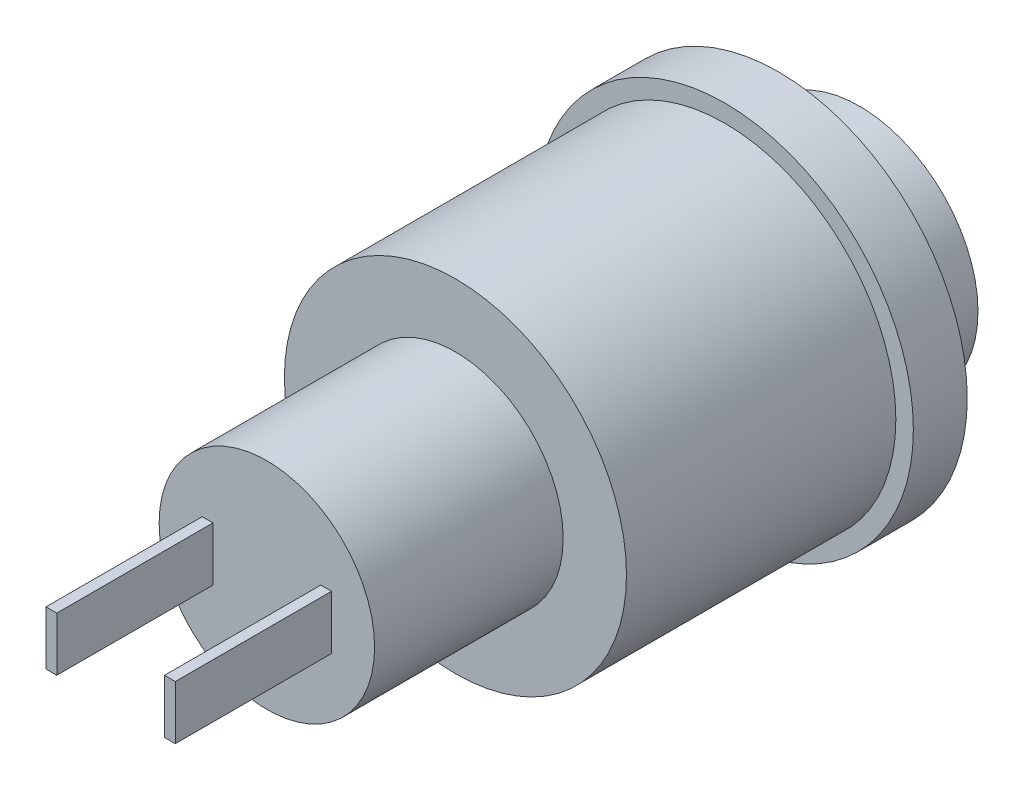
ISO-10303-21;
HEADER;
FILE_DESCRIPTION(('STEP AP214'),'2;1');
FILE_NAME('part.step','',(''),(''),'','','');
FILE_SCHEMA(('AUTOMOTIVE_DESIGN { 1 0 10303 214 1 1 1 1 }'));
ENDSEC;
DATA;
#1=APPLICATION_CONTEXT('core data for automotive mechanical design processes');
#2=APPLICATION_PROTOCOL_DEFINITION('international standard','automotive_design',2000,#1);
#3=PRODUCT_CONTEXT('',#1,'mechanical');
#4=PRODUCT('Part','Part','',(#3));
#5=PRODUCT_RELATED_PRODUCT_CATEGORY('part','',(#4));
#6=PRODUCT_DEFINITION_FORMATION('','',#4);
#7=PRODUCT_DEFINITION_CONTEXT('part definition',#1,'design');
#8=PRODUCT_DEFINITION('design','',#6,#7);
#9=PRODUCT_DEFINITION_SHAPE('','',#8);
#10=(LENGTH_UNIT() NAMED_UNIT(*) SI_UNIT(.MILLI.,.METRE.));
#11=(NAMED_UNIT(*) PLANE_ANGLE_UNIT() SI_UNIT($,.RADIAN.));
#12=(NAMED_UNIT(*) SI_UNIT($,.STERADIAN.) SOLID_ANGLE_UNIT());
#13=UNCERTAINTY_MEASURE_WITH_UNIT(LENGTH_MEASURE(1.E-05),#10,'distance_accuracy_value','');
#14=(GEOMETRIC_REPRESENTATION_CONTEXT(3) GLOBAL_UNCERTAINTY_ASSIGNED_CONTEXT((#13)) GLOBAL_UNIT_ASSIGNED_CONTEXT((#10,
#11,#12)) REPRESENTATION_CONTEXT('',''));
#15=CARTESIAN_POINT('',(0.,0.,0.));
#16=DIRECTION('',(0.,0.,1.));
#17=DIRECTION('',(1.,0.,0.));
#18=AXIS2_PLACEMENT_3D('',#15,#16,#17);
#19=CARTESIAN_POINT('',(0.,0.,22.));
#20=DIRECTION('',(0.,0.,1.));
#21=DIRECTION('',(1.,0.,0.));
#22=AXIS2_PLACEMENT_3D('',#19,#20,#21);
#23=PLANE('',#22);
#24=CARTESIAN_POINT('',(0.,0.,22.));
#25=DIRECTION('',(0.,0.,1.));
#26=DIRECTION('',(1.,0.,0.));
#27=AXIS2_PLACEMENT_3D('',#24,#25,#26);
#28=CIRCLE('',#27,4.);
#29=CARTESIAN_POINT('',(4.,0.,22.));
#30=VERTEX_POINT('',#29);
#31=EDGE_CURVE('E180',#30,#30,#28,.T.);
#32=ORIENTED_EDGE('',*,*,#31,.T.);
#33=EDGE_LOOP('',(#32));
#34=FACE_BOUND('',#33,.T.);
#35=DIRECTION('',(1.,0.,0.));
#36=VECTOR('',#35,1.);
#37=CARTESIAN_POINT('',(-2.4,-1.,22.));
#38=LINE('',#37,#36);
#39=CARTESIAN_POINT('',(-2.4,-1.,22.));
#40=VERTEX_POINT('',#39);
#41=CARTESIAN_POINT('',(-2.,-1.,22.));
#42=VERTEX_POINT('',#41);
#43=EDGE_CURVE('E141',#40,#42,#38,.T.);
#44=ORIENTED_EDGE('',*,*,#43,.F.);
#45=DIRECTION('',(0.,-1.,0.));
#46=VECTOR('',#45,1.);
#47=CARTESIAN_POINT('',(-2.4,1.,22.));
#48=LINE('',#47,#46);
#49=CARTESIAN_POINT('',(-2.4,1.,22.));
#50=VERTEX_POINT('',#49);
#51=EDGE_CURVE('E136',#50,#40,#48,.T.);
#52=ORIENTED_EDGE('',*,*,#51,.F.);
#53=DIRECTION('',(-1.,0.,0.));
#54=VECTOR('',#53,1.);
#55=CARTESIAN_POINT('',(-2.4,1.,22.));
#56=LINE('',#55,#54);
#57=CARTESIAN_POINT('',(-2.,1.,22.));
#58=VERTEX_POINT('',#57);
#59=EDGE_CURVE('E151',#58,#50,#56,.T.);
#60=ORIENTED_EDGE('',*,*,#59,.F.);
#61=DIRECTION('',(0.,1.,0.));
#62=VECTOR('',#61,1.);
#63=CARTESIAN_POINT('',(-2.,1.,22.));
#64=LINE('',#63,#62);
#65=EDGE_CURVE('E163',#42,#58,#64,.T.);
#66=ORIENTED_EDGE('',*,*,#65,.F.);
#67=EDGE_LOOP('',(#44,#52,#60,#66));
#68=FACE_BOUND('',#67,.T.);
#69=DIRECTION('',(1.,0.,0.));
#70=VECTOR('',#69,1.);
#71=CARTESIAN_POINT('',(2.,-0.999999999999999,22.));
#72=LINE('',#71,#70);
#73=CARTESIAN_POINT('',(2.,-0.999999999999999,22.));
#74=VERTEX_POINT('',#73);
#75=CARTESIAN_POINT('',(2.4,-0.999999999999999,22.));
#76=VERTEX_POINT('',#75);
#77=EDGE_CURVE('E397',#74,#76,#72,.T.);
#78=ORIENTED_EDGE('',*,*,#77,.F.);
#79=DIRECTION('',(0.,-1.,0.));
#80=VECTOR('',#79,1.);
#81=CARTESIAN_POINT('',(2.,1.,22.));
#82=LINE('',#81,#80);
#83=CARTESIAN_POINT('',(2.,1.,22.));
#84=VERTEX_POINT('',#83);
#85=EDGE_CURVE('E133',#84,#74,#82,.T.);
#86=ORIENTED_EDGE('',*,*,#85,.F.);
#87=DIRECTION('',(-1.,0.,0.));
#88=VECTOR('',#87,1.);
#89=CARTESIAN_POINT('',(2.,1.,22.));
#90=LINE('',#89,#88);
#91=CARTESIAN_POINT('',(2.4,1.,22.));
#92=VERTEX_POINT('',#91);
#93=EDGE_CURVE('E129',#92,#84,#90,.T.);
#94=ORIENTED_EDGE('',*,*,#93,.F.);
#95=DIRECTION('',(0.,1.,0.));
#96=VECTOR('',#95,1.);
#97=CARTESIAN_POINT('',(2.4,1.,22.));
#98=LINE('',#97,#96);
#99=EDGE_CURVE('E393',#76,#92,#98,.T.);
#100=ORIENTED_EDGE('',*,*,#99,.F.);
#101=EDGE_LOOP('',(#78,#86,#94,#100));
#102=FACE_BOUND('',#101,.T.);
#103=ADVANCED_FACE('F39',(#34,#68,#102),#23,.T.);
#104=CARTESIAN_POINT('',(0.,0.,3.));
#105=DIRECTION('',(0.,0.,-1.));
#106=DIRECTION('',(-1.,0.,0.));
#107=AXIS2_PLACEMENT_3D('',#104,#105,#106);
#108=CYLINDRICAL_SURFACE('',#107,4.4);
#109=CARTESIAN_POINT('',(0.,0.,3.));
#110=DIRECTION('',(0.,0.,1.));
#111=DIRECTION('',(1.,0.,0.));
#112=AXIS2_PLACEMENT_3D('',#109,#110,#111);
#113=CIRCLE('',#112,4.4);
#114=CARTESIAN_POINT('',(4.4,0.,3.));
#115=VERTEX_POINT('',#114);
#116=EDGE_CURVE('E192',#115,#115,#113,.T.);
#117=ORIENTED_EDGE('',*,*,#116,.F.);
#118=EDGE_LOOP('',(#117));
#119=FACE_BOUND('',#118,.T.);
#120=CARTESIAN_POINT('',(0.,0.,0.));
#121=DIRECTION('',(0.,0.,1.));
#122=DIRECTION('',(1.,0.,0.));
#123=AXIS2_PLACEMENT_3D('',#120,#121,#122);
#124=CIRCLE('',#123,4.4);
#125=CARTESIAN_POINT('',(4.4,0.,0.));
#126=VERTEX_POINT('',#125);
#127=EDGE_CURVE('E43',#126,#126,#124,.T.);
#128=ORIENTED_EDGE('',*,*,#127,.T.);
#129=EDGE_LOOP('',(#128));
#130=FACE_BOUND('',#129,.T.);
#131=ADVANCED_FACE('F41',(#119,#130),#108,.T.);
#132=CARTESIAN_POINT('',(0.,0.,0.));
#133=DIRECTION('',(0.,0.,1.));
#134=DIRECTION('',(1.,0.,0.));
#135=AXIS2_PLACEMENT_3D('',#132,#133,#134);
#136=PLANE('',#135);
#137=ORIENTED_EDGE('',*,*,#127,.F.);
#138=EDGE_LOOP('',(#137));
#139=FACE_BOUND('',#138,.T.);
#140=ADVANCED_FACE('F208',(#139),#136,.F.);
#141=CARTESIAN_POINT('',(0.,0.,5.));
#142=DIRECTION('',(0.,0.,-1.));
#143=DIRECTION('',(-1.,0.,0.));
#144=AXIS2_PLACEMENT_3D('',#141,#142,#143);
#145=CYLINDRICAL_SURFACE('',#144,7.);
#146=CARTESIAN_POINT('',(0.,0.,5.));
#147=DIRECTION('',(0.,0.,1.));
#148=DIRECTION('',(1.,0.,0.));
#149=AXIS2_PLACEMENT_3D('',#146,#147,#148);
#150=CIRCLE('',#149,7.);
#151=CARTESIAN_POINT('',(7.,0.,5.));
#152=VERTEX_POINT('',#151);
#153=EDGE_CURVE('E193',#152,#152,#150,.T.);
#154=ORIENTED_EDGE('',*,*,#153,.F.);
#155=EDGE_LOOP('',(#154));
#156=FACE_BOUND('',#155,.T.);
#157=CARTESIAN_POINT('',(0.,0.,3.));
#158=DIRECTION('',(0.,0.,1.));
#159=DIRECTION('',(1.,0.,0.));
#160=AXIS2_PLACEMENT_3D('',#157,#158,#159);
#161=CIRCLE('',#160,7.);
#162=CARTESIAN_POINT('',(7.,0.,3.));
#163=VERTEX_POINT('',#162);
#164=EDGE_CURVE('E188',#163,#163,#161,.T.);
#165=ORIENTED_EDGE('',*,*,#164,.T.);
#166=EDGE_LOOP('',(#165));
#167=FACE_BOUND('',#166,.T.);
#168=ADVANCED_FACE('F210',(#156,#167),#145,.T.);
#169=CARTESIAN_POINT('',(0.,0.,5.));
#170=DIRECTION('',(0.,0.,1.));
#171=DIRECTION('',(1.,0.,0.));
#172=AXIS2_PLACEMENT_3D('',#169,#170,#171);
#173=PLANE('',#172);
#174=CARTESIAN_POINT('',(0.,0.,5.));
#175=DIRECTION('',(0.,0.,1.));
#176=DIRECTION('',(1.,0.,0.));
#177=AXIS2_PLACEMENT_3D('',#174,#175,#176);
#178=CIRCLE('',#177,6.35);
#179=CARTESIAN_POINT('',(6.35,0.,5.));
#180=VERTEX_POINT('',#179);
#181=EDGE_CURVE('E49',#180,#180,#178,.T.);
#182=ORIENTED_EDGE('',*,*,#181,.F.);
#183=EDGE_LOOP('',(#182));
#184=FACE_BOUND('',#183,.T.);
#185=ORIENTED_EDGE('',*,*,#153,.T.);
#186=EDGE_LOOP('',(#185));
#187=FACE_BOUND('',#186,.T.);
#188=ADVANCED_FACE('F215',(#184,#187),#173,.T.);
#189=CARTESIAN_POINT('',(0.,0.,3.));
#190=DIRECTION('',(0.,0.,1.));
#191=DIRECTION('',(1.,0.,0.));
#192=AXIS2_PLACEMENT_3D('',#189,#190,#191);
#193=PLANE('',#192);
#194=ORIENTED_EDGE('',*,*,#116,.T.);
#195=EDGE_LOOP('',(#194));
#196=FACE_BOUND('',#195,.T.);
#197=ORIENTED_EDGE('',*,*,#164,.F.);
#198=EDGE_LOOP('',(#197));
#199=FACE_BOUND('',#198,.T.);
#200=ADVANCED_FACE('F240',(#196,#199),#193,.F.);
#201=CARTESIAN_POINT('',(0.,0.,15.));
#202=DIRECTION('',(0.,0.,-1.));
#203=DIRECTION('',(-1.,0.,0.));
#204=AXIS2_PLACEMENT_3D('',#201,#202,#203);
#205=CYLINDRICAL_SURFACE('',#204,6.35);
#206=CARTESIAN_POINT('',(0.,0.,15.));
#207=DIRECTION('',(0.,0.,1.));
#208=DIRECTION('',(1.,0.,0.));
#209=AXIS2_PLACEMENT_3D('',#206,#207,#208);
#210=CIRCLE('',#209,6.35);
#211=CARTESIAN_POINT('',(6.35,0.,15.));
#212=VERTEX_POINT('',#211);
#213=EDGE_CURVE('E183',#212,#212,#210,.T.);
#214=ORIENTED_EDGE('',*,*,#213,.F.);
#215=EDGE_LOOP('',(#214));
#216=FACE_BOUND('',#215,.T.);
#217=ORIENTED_EDGE('',*,*,#181,.T.);
#218=EDGE_LOOP('',(#217));
#219=FACE_BOUND('',#218,.T.);
#220=ADVANCED_FACE('F236',(#216,#219),#205,.T.);
#221=CARTESIAN_POINT('',(0.,0.,15.));
#222=DIRECTION('',(0.,0.,1.));
#223=DIRECTION('',(1.,0.,0.));
#224=AXIS2_PLACEMENT_3D('',#221,#222,#223);
#225=PLANE('',#224);
#226=CARTESIAN_POINT('',(0.,0.,15.));
#227=DIRECTION('',(0.,0.,1.));
#228=DIRECTION('',(1.,0.,0.));
#229=AXIS2_PLACEMENT_3D('',#226,#227,#228);
#230=CIRCLE('',#229,4.);
#231=CARTESIAN_POINT('',(4.,0.,15.));
#232=VERTEX_POINT('',#231);
#233=EDGE_CURVE('E11',#232,#232,#230,.T.);
#234=ORIENTED_EDGE('',*,*,#233,.F.);
#235=EDGE_LOOP('',(#234));
#236=FACE_BOUND('',#235,.T.);
#237=ORIENTED_EDGE('',*,*,#213,.T.);
#238=EDGE_LOOP('',(#237));
#239=FACE_BOUND('',#238,.T.);
#240=ADVANCED_FACE('F232',(#236,#239),#225,.T.);
#241=CARTESIAN_POINT('',(0.,0.,22.));
#242=DIRECTION('',(0.,0.,-1.));
#243=DIRECTION('',(-1.,0.,0.));
#244=AXIS2_PLACEMENT_3D('',#241,#242,#243);
#245=CYLINDRICAL_SURFACE('',#244,4.);
#246=ORIENTED_EDGE('',*,*,#31,.F.);
#247=EDGE_LOOP('',(#246));
#248=FACE_BOUND('',#247,.T.);
#249=ORIENTED_EDGE('',*,*,#233,.T.);
#250=EDGE_LOOP('',(#249));
#251=FACE_BOUND('',#250,.T.);
#252=ADVANCED_FACE('F229',(#248,#251),#245,.T.);
#253=CARTESIAN_POINT('',(-2.4,1.,27.8));
#254=DIRECTION('',(1.,0.,0.));
#255=DIRECTION('',(0.,0.,-1.));
#256=AXIS2_PLACEMENT_3D('',#253,#254,#255);
#257=PLANE('',#256);
#258=ORIENTED_EDGE('',*,*,#51,.T.);
#259=DIRECTION('',(0.,0.,-1.));
#260=VECTOR('',#259,1.);
#261=CARTESIAN_POINT('',(-2.4,-1.,27.8));
#262=LINE('',#261,#260);
#263=CARTESIAN_POINT('',(-2.4,-1.,27.8));
#264=VERTEX_POINT('',#263);
#265=EDGE_CURVE('E177',#264,#40,#262,.T.);
#266=ORIENTED_EDGE('',*,*,#265,.F.);
#267=DIRECTION('',(0.,-1.,0.));
#268=VECTOR('',#267,1.);
#269=CARTESIAN_POINT('',(-2.4,1.,27.8));
#270=LINE('',#269,#268);
#271=CARTESIAN_POINT('',(-2.4,1.,27.8));
#272=VERTEX_POINT('',#271);
#273=EDGE_CURVE('E146',#272,#264,#270,.T.);
#274=ORIENTED_EDGE('',*,*,#273,.F.);
#275=DIRECTION('',(0.,0.,-1.));
#276=VECTOR('',#275,1.);
#277=CARTESIAN_POINT('',(-2.4,1.,27.8));
#278=LINE('',#277,#276);
#279=EDGE_CURVE('E159',#272,#50,#278,.T.);
#280=ORIENTED_EDGE('',*,*,#279,.T.);
#281=EDGE_LOOP('',(#258,#266,#274,#280));
#282=FACE_BOUND('',#281,.T.);
#283=ADVANCED_FACE('F227',(#282),#257,.F.);
#284=CARTESIAN_POINT('',(-2.4,-1.,27.8));
#285=DIRECTION('',(0.,1.,0.));
#286=DIRECTION('',(0.,0.,1.));
#287=AXIS2_PLACEMENT_3D('',#284,#285,#286);
#288=PLANE('',#287);
#289=ORIENTED_EDGE('',*,*,#43,.T.);
#290=DIRECTION('',(0.,0.,-1.));
#291=VECTOR('',#290,1.);
#292=CARTESIAN_POINT('',(-2.,-1.,27.8));
#293=LINE('',#292,#291);
#294=CARTESIAN_POINT('',(-2.,-1.,27.8));
#295=VERTEX_POINT('',#294);
#296=EDGE_CURVE('E173',#295,#42,#293,.T.);
#297=ORIENTED_EDGE('',*,*,#296,.F.);
#298=DIRECTION('',(1.,0.,0.));
#299=VECTOR('',#298,1.);
#300=CARTESIAN_POINT('',(-2.4,-1.,27.8));
#301=LINE('',#300,#299);
#302=EDGE_CURVE('E150',#264,#295,#301,.T.);
#303=ORIENTED_EDGE('',*,*,#302,.F.);
#304=ORIENTED_EDGE('',*,*,#265,.T.);
#305=EDGE_LOOP('',(#289,#297,#303,#304));
#306=FACE_BOUND('',#305,.T.);
#307=ADVANCED_FACE('F272',(#306),#288,.F.);
#308=CARTESIAN_POINT('',(-2.,1.,27.8));
#309=DIRECTION('',(-1.,0.,0.));
#310=DIRECTION('',(0.,0.,1.));
#311=AXIS2_PLACEMENT_3D('',#308,#309,#310);
#312=PLANE('',#311);
#313=ORIENTED_EDGE('',*,*,#65,.T.);
#314=DIRECTION('',(0.,0.,-1.));
#315=VECTOR('',#314,1.);
#316=CARTESIAN_POINT('',(-2.,1.,27.8));
#317=LINE('',#316,#315);
#318=CARTESIAN_POINT('',(-2.,1.,27.8));
#319=VERTEX_POINT('',#318);
#320=EDGE_CURVE('E65',#319,#58,#317,.T.);
#321=ORIENTED_EDGE('',*,*,#320,.F.);
#322=DIRECTION('',(0.,1.,0.));
#323=VECTOR('',#322,1.);
#324=CARTESIAN_POINT('',(-2.,1.,27.8));
#325=LINE('',#324,#323);
#326=EDGE_CURVE('E154',#295,#319,#325,.T.);
#327=ORIENTED_EDGE('',*,*,#326,.F.);
#328=ORIENTED_EDGE('',*,*,#296,.T.);
#329=EDGE_LOOP('',(#313,#321,#327,#328));
#330=FACE_BOUND('',#329,.T.);
#331=ADVANCED_FACE('F279',(#330),#312,.F.);
#332=CARTESIAN_POINT('',(-2.4,1.,27.8));
#333=DIRECTION('',(0.,-1.,0.));
#334=DIRECTION('',(0.,0.,-1.));
#335=AXIS2_PLACEMENT_3D('',#332,#333,#334);
#336=PLANE('',#335);
#337=ORIENTED_EDGE('',*,*,#59,.T.);
#338=ORIENTED_EDGE('',*,*,#279,.F.);
#339=DIRECTION('',(-1.,0.,0.));
#340=VECTOR('',#339,1.);
#341=CARTESIAN_POINT('',(-2.4,1.,27.8));
#342=LINE('',#341,#340);
#343=EDGE_CURVE('E157',#319,#272,#342,.T.);
#344=ORIENTED_EDGE('',*,*,#343,.F.);
#345=ORIENTED_EDGE('',*,*,#320,.T.);
#346=EDGE_LOOP('',(#337,#338,#344,#345));
#347=FACE_BOUND('',#346,.T.);
#348=ADVANCED_FACE('F286',(#347),#336,.F.);
#349=CARTESIAN_POINT('',(0.,0.,27.8));
#350=DIRECTION('',(0.,0.,1.));
#351=DIRECTION('',(1.,0.,0.));
#352=AXIS2_PLACEMENT_3D('',#349,#350,#351);
#353=PLANE('',#352);
#354=ORIENTED_EDGE('',*,*,#273,.T.);
#355=ORIENTED_EDGE('',*,*,#302,.T.);
#356=ORIENTED_EDGE('',*,*,#326,.T.);
#357=ORIENTED_EDGE('',*,*,#343,.T.);
#358=EDGE_LOOP('',(#354,#355,#356,#357));
#359=FACE_BOUND('',#358,.T.);
#360=ADVANCED_FACE('F294',(#359),#353,.T.);
#361=CARTESIAN_POINT('',(2.,1.,27.8));
#362=DIRECTION('',(1.,0.,0.));
#363=DIRECTION('',(0.,0.,-1.));
#364=AXIS2_PLACEMENT_3D('',#361,#362,#363);
#365=PLANE('',#364);
#366=ORIENTED_EDGE('',*,*,#85,.T.);
#367=DIRECTION('',(0.,0.,-1.));
#368=VECTOR('',#367,1.);
#369=CARTESIAN_POINT('',(2.,-0.999999999999999,27.8));
#370=LINE('',#369,#368);
#371=CARTESIAN_POINT('',(2.,-0.999999999999999,27.8));
#372=VERTEX_POINT('',#371);
#373=EDGE_CURVE('E112',#372,#74,#370,.T.);
#374=ORIENTED_EDGE('',*,*,#373,.F.);
#375=DIRECTION('',(0.,-1.,0.));
#376=VECTOR('',#375,1.);
#377=CARTESIAN_POINT('',(2.,1.,27.8));
#378=LINE('',#377,#376);
#379=CARTESIAN_POINT('',(2.,1.,27.8));
#380=VERTEX_POINT('',#379);
#381=EDGE_CURVE('E120',#380,#372,#378,.T.);
#382=ORIENTED_EDGE('',*,*,#381,.F.);
#383=DIRECTION('',(0.,0.,-1.));
#384=VECTOR('',#383,1.);
#385=CARTESIAN_POINT('',(2.,1.,27.8));
#386=LINE('',#385,#384);
#387=EDGE_CURVE('E389',#380,#84,#386,.T.);
#388=ORIENTED_EDGE('',*,*,#387,.T.);
#389=EDGE_LOOP('',(#366,#374,#382,#388));
#390=FACE_BOUND('',#389,.T.);
#391=ADVANCED_FACE('F131',(#390),#365,.F.);
#392=CARTESIAN_POINT('',(2.,-0.999999999999999,27.8));
#393=DIRECTION('',(0.,1.,0.));
#394=DIRECTION('',(-1.,0.,0.));
#395=AXIS2_PLACEMENT_3D('',#392,#393,#394);
#396=PLANE('',#395);
#397=ORIENTED_EDGE('',*,*,#77,.T.);
#398=DIRECTION('',(0.,0.,-1.));
#399=VECTOR('',#398,1.);
#400=CARTESIAN_POINT('',(2.4,-0.999999999999999,27.8));
#401=LINE('',#400,#399);
#402=CARTESIAN_POINT('',(2.4,-0.999999999999999,27.8));
#403=VERTEX_POINT('',#402);
#404=EDGE_CURVE('E115',#403,#76,#401,.T.);
#405=ORIENTED_EDGE('',*,*,#404,.F.);
#406=DIRECTION('',(1.,0.,0.));
#407=VECTOR('',#406,1.);
#408=CARTESIAN_POINT('',(2.,-0.999999999999999,27.8));
#409=LINE('',#408,#407);
#410=EDGE_CURVE('E108',#372,#403,#409,.T.);
#411=ORIENTED_EDGE('',*,*,#410,.F.);
#412=ORIENTED_EDGE('',*,*,#373,.T.);
#413=EDGE_LOOP('',(#397,#405,#411,#412));
#414=FACE_BOUND('',#413,.T.);
#415=ADVANCED_FACE('F110',(#414),#396,.F.);
#416=CARTESIAN_POINT('',(2.4,1.,27.8));
#417=DIRECTION('',(-1.,0.,0.));
#418=DIRECTION('',(0.,0.,1.));
#419=AXIS2_PLACEMENT_3D('',#416,#417,#418);
#420=PLANE('',#419);
#421=ORIENTED_EDGE('',*,*,#99,.T.);
#422=DIRECTION('',(0.,0.,-1.));
#423=VECTOR('',#422,1.);
#424=CARTESIAN_POINT('',(2.4,1.,27.8));
#425=LINE('',#424,#423);
#426=CARTESIAN_POINT('',(2.4,1.,27.8));
#427=VERTEX_POINT('',#426);
#428=EDGE_CURVE('E57',#427,#92,#425,.T.);
#429=ORIENTED_EDGE('',*,*,#428,.F.);
#430=DIRECTION('',(0.,1.,0.));
#431=VECTOR('',#430,1.);
#432=CARTESIAN_POINT('',(2.4,1.,27.8));
#433=LINE('',#432,#431);
#434=EDGE_CURVE('E119',#403,#427,#433,.T.);
#435=ORIENTED_EDGE('',*,*,#434,.F.);
#436=ORIENTED_EDGE('',*,*,#404,.T.);
#437=EDGE_LOOP('',(#421,#429,#435,#436));
#438=FACE_BOUND('',#437,.T.);
#439=ADVANCED_FACE('F314',(#438),#420,.F.);
#440=CARTESIAN_POINT('',(2.,1.,27.8));
#441=DIRECTION('',(0.,-1.,0.));
#442=DIRECTION('',(1.,0.,0.));
#443=AXIS2_PLACEMENT_3D('',#440,#441,#442);
#444=PLANE('',#443);
#445=ORIENTED_EDGE('',*,*,#93,.T.);
#446=ORIENTED_EDGE('',*,*,#387,.F.);
#447=DIRECTION('',(-1.,0.,0.));
#448=VECTOR('',#447,1.);
#449=CARTESIAN_POINT('',(2.,1.,27.8));
#450=LINE('',#449,#448);
#451=EDGE_CURVE('E124',#427,#380,#450,.T.);
#452=ORIENTED_EDGE('',*,*,#451,.F.);
#453=ORIENTED_EDGE('',*,*,#428,.T.);
#454=EDGE_LOOP('',(#445,#446,#452,#453));
#455=FACE_BOUND('',#454,.T.);
#456=ADVANCED_FACE('F321',(#455),#444,.F.);
#457=CARTESIAN_POINT('',(0.,0.,27.8));
#458=DIRECTION('',(0.,0.,1.));
#459=DIRECTION('',(1.,0.,0.));
#460=AXIS2_PLACEMENT_3D('',#457,#458,#459);
#461=PLANE('',#460);
#462=ORIENTED_EDGE('',*,*,#381,.T.);
#463=ORIENTED_EDGE('',*,*,#410,.T.);
#464=ORIENTED_EDGE('',*,*,#434,.T.);
#465=ORIENTED_EDGE('',*,*,#451,.T.);
#466=EDGE_LOOP('',(#462,#463,#464,#465));
#467=FACE_BOUND('',#466,.T.);
#468=ADVANCED_FACE('F123',(#467),#461,.T.);
#469=CLOSED_SHELL('',(#103,#131,#140,#168,#188,#200,#220,#240,#252,#283,#307,#331,#348,#360,
#391,#415,#439,#456,#468));
#470=MANIFOLD_SOLID_BREP('B2',#469);
#471=ADVANCED_BREP_SHAPE_REPRESENTATION('',(#18,#470),#14);
#472=SHAPE_DEFINITION_REPRESENTATION(#9,#471);
ENDSEC;
END-ISO-10303-21;
